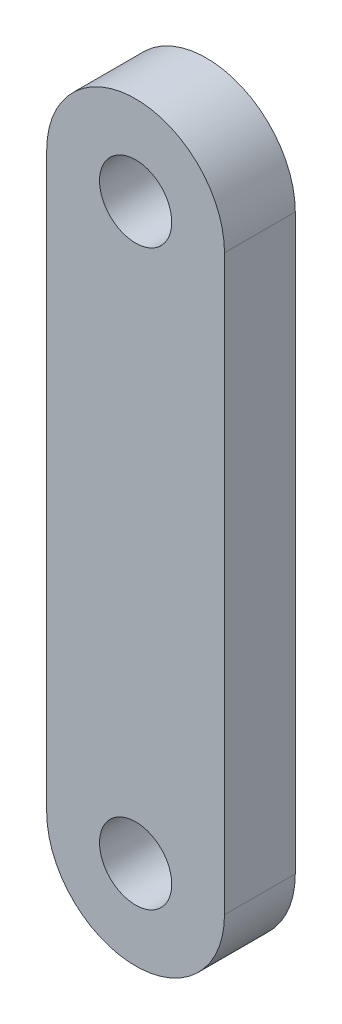
ISO-10303-21;
HEADER;
FILE_DESCRIPTION(('STEP AP214'),'2;1');
FILE_NAME('part.step','',(''),(''),'','','');
FILE_SCHEMA(('AUTOMOTIVE_DESIGN { 1 0 10303 214 1 1 1 1 }'));
ENDSEC;
DATA;
#1=APPLICATION_CONTEXT('core data for automotive mechanical design processes');
#2=APPLICATION_PROTOCOL_DEFINITION('international standard','automotive_design',2000,#1);
#3=PRODUCT_CONTEXT('',#1,'mechanical');
#4=PRODUCT('Part','Part','',(#3));
#5=PRODUCT_RELATED_PRODUCT_CATEGORY('part','',(#4));
#6=PRODUCT_DEFINITION_FORMATION('','',#4);
#7=PRODUCT_DEFINITION_CONTEXT('part definition',#1,'design');
#8=PRODUCT_DEFINITION('design','',#6,#7);
#9=PRODUCT_DEFINITION_SHAPE('','',#8);
#10=(LENGTH_UNIT() NAMED_UNIT(*) SI_UNIT(.MILLI.,.METRE.));
#11=(NAMED_UNIT(*) PLANE_ANGLE_UNIT() SI_UNIT($,.RADIAN.));
#12=(NAMED_UNIT(*) SI_UNIT($,.STERADIAN.) SOLID_ANGLE_UNIT());
#13=UNCERTAINTY_MEASURE_WITH_UNIT(LENGTH_MEASURE(1.E-05),#10,'distance_accuracy_value','');
#14=(GEOMETRIC_REPRESENTATION_CONTEXT(3) GLOBAL_UNCERTAINTY_ASSIGNED_CONTEXT((#13)) GLOBAL_UNIT_ASSIGNED_CONTEXT((#10,
#11,#12)) REPRESENTATION_CONTEXT('',''));
#15=CARTESIAN_POINT('',(0.,0.,0.));
#16=DIRECTION('',(0.,0.,1.));
#17=DIRECTION('',(1.,0.,0.));
#18=AXIS2_PLACEMENT_3D('',#15,#16,#17);
#19=CARTESIAN_POINT('',(0.,38.0750020317063,6.35));
#20=DIRECTION('',(0.,0.,1.));
#21=DIRECTION('',(1.,0.,0.));
#22=AXIS2_PLACEMENT_3D('',#19,#20,#21);
#23=PLANE('',#22);
#24=CARTESIAN_POINT('',(0.,38.0750020317063,6.35));
#25=DIRECTION('',(0.,0.,1.));
#26=DIRECTION('',(1.,0.,0.));
#27=AXIS2_PLACEMENT_3D('',#24,#25,#26);
#28=CIRCLE('',#27,3.2385);
#29=CARTESIAN_POINT('',(3.2385,38.0750020317063,6.35));
#30=VERTEX_POINT('',#29);
#31=EDGE_CURVE('E100',#30,#30,#28,.T.);
#32=ORIENTED_EDGE('',*,*,#31,.F.);
#33=EDGE_LOOP('',(#32));
#34=FACE_BOUND('',#33,.T.);
#35=CARTESIAN_POINT('',(0.,38.0750020317063,6.35));
#36=DIRECTION('',(0.,0.,1.));
#37=DIRECTION('',(1.,0.,0.));
#38=AXIS2_PLACEMENT_3D('',#35,#36,#37);
#39=CIRCLE('',#38,7.9756);
#40=CARTESIAN_POINT('',(7.9756,38.0750020317063,6.35));
#41=VERTEX_POINT('',#40);
#42=CARTESIAN_POINT('',(-7.9756,38.0750020317063,6.35));
#43=VERTEX_POINT('',#42);
#44=EDGE_CURVE('E85',#41,#43,#39,.T.);
#45=ORIENTED_EDGE('',*,*,#44,.T.);
#46=DIRECTION('',(0.,-1.,0.));
#47=VECTOR('',#46,1.);
#48=CARTESIAN_POINT('',(-7.9756,38.0750020317063,6.35));
#49=LINE('',#48,#47);
#50=CARTESIAN_POINT('',(-7.9756,-13.3599979682937,6.35));
#51=VERTEX_POINT('',#50);
#52=EDGE_CURVE('E80',#43,#51,#49,.T.);
#53=ORIENTED_EDGE('',*,*,#52,.T.);
#54=CARTESIAN_POINT('',(0.,-13.3599979682937,6.35));
#55=DIRECTION('',(0.,0.,1.));
#56=DIRECTION('',(1.,0.,0.));
#57=AXIS2_PLACEMENT_3D('',#54,#55,#56);
#58=CIRCLE('',#57,7.9756);
#59=CARTESIAN_POINT('',(7.97560000000001,-13.3599979682937,6.35));
#60=VERTEX_POINT('',#59);
#61=EDGE_CURVE('E83',#51,#60,#58,.T.);
#62=ORIENTED_EDGE('',*,*,#61,.T.);
#63=DIRECTION('',(0.,1.,0.));
#64=VECTOR('',#63,1.);
#65=CARTESIAN_POINT('',(7.9756,38.0750020317063,6.35));
#66=LINE('',#65,#64);
#67=EDGE_CURVE('E50',#60,#41,#66,.T.);
#68=ORIENTED_EDGE('',*,*,#67,.T.);
#69=EDGE_LOOP('',(#45,#53,#62,#68));
#70=FACE_BOUND('',#69,.T.);
#71=CARTESIAN_POINT('',(0.,-13.3599979682937,6.35));
#72=DIRECTION('',(0.,0.,1.));
#73=DIRECTION('',(1.,0.,0.));
#74=AXIS2_PLACEMENT_3D('',#71,#72,#73);
#75=CIRCLE('',#74,3.2385);
#76=CARTESIAN_POINT('',(3.2385,-13.3599979682937,6.35));
#77=VERTEX_POINT('',#76);
#78=EDGE_CURVE('E115',#77,#77,#75,.T.);
#79=ORIENTED_EDGE('',*,*,#78,.F.);
#80=EDGE_LOOP('',(#79));
#81=FACE_BOUND('',#80,.T.);
#82=ADVANCED_FACE('F33',(#34,#70,#81),#23,.T.);
#83=CARTESIAN_POINT('',(0.,38.0750020317063,0.));
#84=DIRECTION('',(0.,0.,1.));
#85=DIRECTION('',(1.,0.,0.));
#86=AXIS2_PLACEMENT_3D('',#83,#84,#85);
#87=PLANE('',#86);
#88=CARTESIAN_POINT('',(0.,38.0750020317063,0.));
#89=DIRECTION('',(0.,0.,1.));
#90=DIRECTION('',(1.,0.,0.));
#91=AXIS2_PLACEMENT_3D('',#88,#89,#90);
#92=CIRCLE('',#91,7.9756);
#93=CARTESIAN_POINT('',(7.9756,38.0750020317063,0.));
#94=VERTEX_POINT('',#93);
#95=CARTESIAN_POINT('',(-7.9756,38.0750020317063,0.));
#96=VERTEX_POINT('',#95);
#97=EDGE_CURVE('E97',#94,#96,#92,.T.);
#98=ORIENTED_EDGE('',*,*,#97,.F.);
#99=DIRECTION('',(0.,1.,0.));
#100=VECTOR('',#99,1.);
#101=CARTESIAN_POINT('',(7.9756,38.0750020317063,0.));
#102=LINE('',#101,#100);
#103=CARTESIAN_POINT('',(7.97560000000001,-13.3599979682937,0.));
#104=VERTEX_POINT('',#103);
#105=EDGE_CURVE('E73',#104,#94,#102,.T.);
#106=ORIENTED_EDGE('',*,*,#105,.F.);
#107=CARTESIAN_POINT('',(0.,-13.3599979682937,0.));
#108=DIRECTION('',(0.,0.,1.));
#109=DIRECTION('',(1.,0.,0.));
#110=AXIS2_PLACEMENT_3D('',#107,#108,#109);
#111=CIRCLE('',#110,7.9756);
#112=CARTESIAN_POINT('',(-7.9756,-13.3599979682937,0.));
#113=VERTEX_POINT('',#112);
#114=EDGE_CURVE('E67',#113,#104,#111,.T.);
#115=ORIENTED_EDGE('',*,*,#114,.F.);
#116=DIRECTION('',(0.,-1.,0.));
#117=VECTOR('',#116,1.);
#118=CARTESIAN_POINT('',(-7.9756,38.0750020317063,0.));
#119=LINE('',#118,#117);
#120=EDGE_CURVE('E89',#96,#113,#119,.T.);
#121=ORIENTED_EDGE('',*,*,#120,.F.);
#122=EDGE_LOOP('',(#98,#106,#115,#121));
#123=FACE_BOUND('',#122,.T.);
#124=CARTESIAN_POINT('',(0.,38.0750020317063,0.));
#125=DIRECTION('',(0.,0.,1.));
#126=DIRECTION('',(1.,0.,0.));
#127=AXIS2_PLACEMENT_3D('',#124,#125,#126);
#128=CIRCLE('',#127,3.2385);
#129=CARTESIAN_POINT('',(3.2385,38.0750020317063,0.));
#130=VERTEX_POINT('',#129);
#131=EDGE_CURVE('E112',#130,#130,#128,.T.);
#132=ORIENTED_EDGE('',*,*,#131,.T.);
#133=EDGE_LOOP('',(#132));
#134=FACE_BOUND('',#133,.T.);
#135=CARTESIAN_POINT('',(0.,-13.3599979682937,0.));
#136=DIRECTION('',(0.,0.,1.));
#137=DIRECTION('',(1.,0.,0.));
#138=AXIS2_PLACEMENT_3D('',#135,#136,#137);
#139=CIRCLE('',#138,3.2385);
#140=CARTESIAN_POINT('',(3.2385,-13.3599979682937,0.));
#141=VERTEX_POINT('',#140);
#142=EDGE_CURVE('E118',#141,#141,#139,.T.);
#143=ORIENTED_EDGE('',*,*,#142,.T.);
#144=EDGE_LOOP('',(#143));
#145=FACE_BOUND('',#144,.T.);
#146=ADVANCED_FACE('F108',(#123,#134,#145),#87,.F.);
#147=CARTESIAN_POINT('',(0.,38.0750020317063,6.35));
#148=DIRECTION('',(0.,0.,-1.));
#149=DIRECTION('',(-1.,0.,0.));
#150=AXIS2_PLACEMENT_3D('',#147,#148,#149);
#151=CYLINDRICAL_SURFACE('',#150,7.9756);
#152=ORIENTED_EDGE('',*,*,#97,.T.);
#153=DIRECTION('',(0.,0.,-1.));
#154=VECTOR('',#153,1.);
#155=CARTESIAN_POINT('',(-7.9756,38.0750020317063,6.35));
#156=LINE('',#155,#154);
#157=EDGE_CURVE('E11',#43,#96,#156,.T.);
#158=ORIENTED_EDGE('',*,*,#157,.F.);
#159=ORIENTED_EDGE('',*,*,#44,.F.);
#160=DIRECTION('',(0.,0.,-1.));
#161=VECTOR('',#160,1.);
#162=CARTESIAN_POINT('',(7.9756,38.0750020317063,6.35));
#163=LINE('',#162,#161);
#164=EDGE_CURVE('E93',#41,#94,#163,.T.);
#165=ORIENTED_EDGE('',*,*,#164,.T.);
#166=EDGE_LOOP('',(#152,#158,#159,#165));
#167=FACE_BOUND('',#166,.T.);
#168=ADVANCED_FACE('F35',(#167),#151,.T.);
#169=CARTESIAN_POINT('',(-7.9756,38.0750020317063,6.35));
#170=DIRECTION('',(1.,0.,0.));
#171=DIRECTION('',(0.,1.,0.));
#172=AXIS2_PLACEMENT_3D('',#169,#170,#171);
#173=PLANE('',#172);
#174=ORIENTED_EDGE('',*,*,#120,.T.);
#175=DIRECTION('',(0.,0.,-1.));
#176=VECTOR('',#175,1.);
#177=CARTESIAN_POINT('',(-7.9756,-13.3599979682937,6.35));
#178=LINE('',#177,#176);
#179=EDGE_CURVE('E42',#51,#113,#178,.T.);
#180=ORIENTED_EDGE('',*,*,#179,.F.);
#181=ORIENTED_EDGE('',*,*,#52,.F.);
#182=ORIENTED_EDGE('',*,*,#157,.T.);
#183=EDGE_LOOP('',(#174,#180,#181,#182));
#184=FACE_BOUND('',#183,.T.);
#185=ADVANCED_FACE('F88',(#184),#173,.F.);
#186=CARTESIAN_POINT('',(0.,-13.3599979682937,6.35));
#187=DIRECTION('',(0.,0.,-1.));
#188=DIRECTION('',(-1.,0.,0.));
#189=AXIS2_PLACEMENT_3D('',#186,#187,#188);
#190=CYLINDRICAL_SURFACE('',#189,7.9756);
#191=ORIENTED_EDGE('',*,*,#114,.T.);
#192=DIRECTION('',(0.,0.,-1.));
#193=VECTOR('',#192,1.);
#194=CARTESIAN_POINT('',(7.97560000000001,-13.3599979682937,6.35));
#195=LINE('',#194,#193);
#196=EDGE_CURVE('E90',#60,#104,#195,.T.);
#197=ORIENTED_EDGE('',*,*,#196,.F.);
#198=ORIENTED_EDGE('',*,*,#61,.F.);
#199=ORIENTED_EDGE('',*,*,#179,.T.);
#200=EDGE_LOOP('',(#191,#197,#198,#199));
#201=FACE_BOUND('',#200,.T.);
#202=ADVANCED_FACE('F91',(#201),#190,.T.);
#203=CARTESIAN_POINT('',(7.9756,38.0750020317063,6.35));
#204=DIRECTION('',(-1.,0.,0.));
#205=DIRECTION('',(0.,-1.,0.));
#206=AXIS2_PLACEMENT_3D('',#203,#204,#205);
#207=PLANE('',#206);
#208=ORIENTED_EDGE('',*,*,#105,.T.);
#209=ORIENTED_EDGE('',*,*,#164,.F.);
#210=ORIENTED_EDGE('',*,*,#67,.F.);
#211=ORIENTED_EDGE('',*,*,#196,.T.);
#212=EDGE_LOOP('',(#208,#209,#210,#211));
#213=FACE_BOUND('',#212,.T.);
#214=ADVANCED_FACE('F105',(#213),#207,.F.);
#215=CARTESIAN_POINT('',(0.,38.0750020317063,6.35));
#216=DIRECTION('',(0.,0.,-1.));
#217=DIRECTION('',(-1.,0.,0.));
#218=AXIS2_PLACEMENT_3D('',#215,#216,#217);
#219=CYLINDRICAL_SURFACE('',#218,3.2385);
#220=ORIENTED_EDGE('',*,*,#31,.T.);
#221=EDGE_LOOP('',(#220));
#222=FACE_BOUND('',#221,.T.);
#223=ORIENTED_EDGE('',*,*,#131,.F.);
#224=EDGE_LOOP('',(#223));
#225=FACE_BOUND('',#224,.T.);
#226=ADVANCED_FACE('F135',(#222,#225),#219,.F.);
#227=CARTESIAN_POINT('',(0.,-13.3599979682937,6.35));
#228=DIRECTION('',(0.,0.,-1.));
#229=DIRECTION('',(-1.,0.,0.));
#230=AXIS2_PLACEMENT_3D('',#227,#228,#229);
#231=CYLINDRICAL_SURFACE('',#230,3.2385);
#232=ORIENTED_EDGE('',*,*,#78,.T.);
#233=EDGE_LOOP('',(#232));
#234=FACE_BOUND('',#233,.T.);
#235=ORIENTED_EDGE('',*,*,#142,.F.);
#236=EDGE_LOOP('',(#235));
#237=FACE_BOUND('',#236,.T.);
#238=ADVANCED_FACE('F124',(#234,#237),#231,.F.);
#239=CLOSED_SHELL('',(#82,#146,#168,#185,#202,#214,#226,#238));
#240=MANIFOLD_SOLID_BREP('B2',#239);
#241=ADVANCED_BREP_SHAPE_REPRESENTATION('',(#18,#240),#14);
#242=SHAPE_DEFINITION_REPRESENTATION(#9,#241);
ENDSEC;
END-ISO-10303-21;
